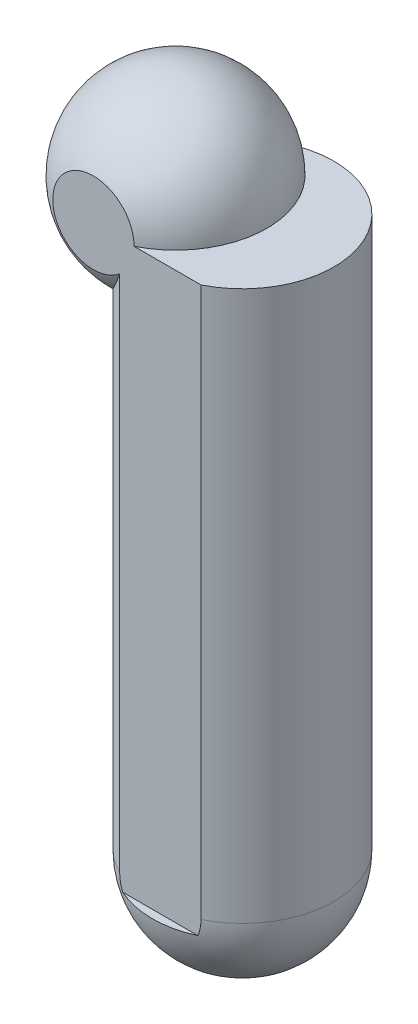
ISO-10303-21;
HEADER;
FILE_DESCRIPTION(('STEP AP214'),'2;1');
FILE_NAME('part.step','',(''),(''),'','','');
FILE_SCHEMA(('AUTOMOTIVE_DESIGN { 1 0 10303 214 1 1 1 1 }'));
ENDSEC;
DATA;
#1=APPLICATION_CONTEXT('core data for automotive mechanical design processes');
#2=APPLICATION_PROTOCOL_DEFINITION('international standard','automotive_design',2000,#1);
#3=PRODUCT_CONTEXT('',#1,'mechanical');
#4=PRODUCT('Part','Part','',(#3));
#5=PRODUCT_RELATED_PRODUCT_CATEGORY('part','',(#4));
#6=PRODUCT_DEFINITION_FORMATION('','',#4);
#7=PRODUCT_DEFINITION_CONTEXT('part definition',#1,'design');
#8=PRODUCT_DEFINITION('design','',#6,#7);
#9=PRODUCT_DEFINITION_SHAPE('','',#8);
#10=(LENGTH_UNIT() NAMED_UNIT(*) SI_UNIT(.MILLI.,.METRE.));
#11=(NAMED_UNIT(*) PLANE_ANGLE_UNIT() SI_UNIT($,.RADIAN.));
#12=(NAMED_UNIT(*) SI_UNIT($,.STERADIAN.) SOLID_ANGLE_UNIT());
#13=UNCERTAINTY_MEASURE_WITH_UNIT(LENGTH_MEASURE(1.E-05),#10,'distance_accuracy_value','');
#14=(GEOMETRIC_REPRESENTATION_CONTEXT(3) GLOBAL_UNCERTAINTY_ASSIGNED_CONTEXT((#13)) GLOBAL_UNIT_ASSIGNED_CONTEXT((#10,
#11,#12)) REPRESENTATION_CONTEXT('',''));
#15=CARTESIAN_POINT('',(0.,0.,0.));
#16=DIRECTION('',(0.,0.,1.));
#17=DIRECTION('',(1.,0.,0.));
#18=AXIS2_PLACEMENT_3D('',#15,#16,#17);
#19=CARTESIAN_POINT('',(0.,300.,0.));
#20=DIRECTION('',(0.,-1.,0.));
#21=DIRECTION('',(0.,0.,-1.));
#22=AXIS2_PLACEMENT_3D('',#19,#20,#21);
#23=CYLINDRICAL_SURFACE('',#22,50.);
#24=CARTESIAN_POINT('',(0.,300.,0.));
#25=DIRECTION('',(0.,1.,0.));
#26=DIRECTION('',(0.,0.,1.));
#27=AXIS2_PLACEMENT_3D('',#24,#25,#26);
#28=CIRCLE('',#27,50.);
#29=CARTESIAN_POINT('',(22.1848657358327,300.,44.8088354265437));
#30=VERTEX_POINT('',#29);
#31=CARTESIAN_POINT('',(-18.26341711681,300.,-46.5451135482277));
#32=VERTEX_POINT('',#31);
#33=EDGE_CURVE('E115',#30,#32,#28,.T.);
#34=ORIENTED_EDGE('',*,*,#33,.F.);
#35=DIRECTION('',(0.,-1.,0.));
#36=VECTOR('',#35,1.);
#37=CARTESIAN_POINT('',(22.1848657358327,300.,44.8088354265437));
#38=LINE('',#37,#36);
#39=CARTESIAN_POINT('',(22.1848657358327,0.,44.8088354265437));
#40=VERTEX_POINT('',#39);
#41=EDGE_CURVE('E136',#30,#40,#38,.T.);
#42=ORIENTED_EDGE('',*,*,#41,.T.);
#43=CARTESIAN_POINT('',(0.,0.,0.));
#44=DIRECTION('',(0.,1.,0.));
#45=DIRECTION('',(0.,0.,1.));
#46=AXIS2_PLACEMENT_3D('',#43,#44,#45);
#47=CIRCLE('',#46,50.);
#48=CARTESIAN_POINT('',(-47.1795612546556,0.,-16.5556334768018));
#49=VERTEX_POINT('',#48);
#50=EDGE_CURVE('E54',#40,#49,#47,.T.);
#51=ORIENTED_EDGE('',*,*,#50,.T.);
#52=DIRECTION('',(0.,-1.,0.));
#53=VECTOR('',#52,1.);
#54=CARTESIAN_POINT('',(-47.1795612546556,300.,-16.5556334768018));
#55=LINE('',#54,#53);
#56=CARTESIAN_POINT('',(-47.1795612546556,247.914072229141,-16.5556334768018));
#57=VERTEX_POINT('',#56);
#58=EDGE_CURVE('E104',#49,#57,#55,.F.);
#59=ORIENTED_EDGE('',*,*,#58,.T.);
#60=CARTESIAN_POINT('',(0.,247.914072229141,0.));
#61=DIRECTION('',(0.,1.,0.));
#62=DIRECTION('',(0.,0.,1.));
#63=AXIS2_PLACEMENT_3D('',#60,#61,#62);
#64=CIRCLE('',#63,50.);
#65=CARTESIAN_POINT('',(-47.1795612546556,247.914072229141,16.5556334768018));
#66=VERTEX_POINT('',#65);
#67=EDGE_CURVE('E89',#57,#66,#64,.T.);
#68=ORIENTED_EDGE('',*,*,#67,.T.);
#69=DIRECTION('',(0.,-1.,0.));
#70=VECTOR('',#69,1.);
#71=CARTESIAN_POINT('',(-47.1795612546556,300.,16.5556334768018));
#72=LINE('',#71,#70);
#73=CARTESIAN_POINT('',(-47.1795612546556,0.,16.5556334768018));
#74=VERTEX_POINT('',#73);
#75=EDGE_CURVE('E99',#66,#74,#72,.T.);
#76=ORIENTED_EDGE('',*,*,#75,.T.);
#77=CARTESIAN_POINT('',(-22.1848657358327,0.,44.8088354265437));
#78=VERTEX_POINT('',#77);
#79=EDGE_CURVE('E98',#74,#78,#47,.T.);
#80=ORIENTED_EDGE('',*,*,#79,.T.);
#81=DIRECTION('',(0.,-1.,0.));
#82=VECTOR('',#81,1.);
#83=CARTESIAN_POINT('',(-22.1848657358327,300.,44.8088354265437));
#84=LINE('',#83,#82);
#85=CARTESIAN_POINT('',(-22.1848657358327,283.074391965858,44.8088354265437));
#86=VERTEX_POINT('',#85);
#87=EDGE_CURVE('E92',#78,#86,#84,.F.);
#88=ORIENTED_EDGE('',*,*,#87,.T.);
#89=CARTESIAN_POINT('',(-18.2634171173575,300.0002,46.5451135480129));
#90=CARTESIAN_POINT('',(-18.2633706675614,299.438291616511,46.5451056879245));
#91=CARTESIAN_POINT('',(-18.2763760333173,298.876398321375,46.5400280630606));
#92=CARTESIAN_POINT('',(-18.328168188604,297.754032021396,46.5196696715049));
#93=CARTESIAN_POINT('',(-18.3669528141591,297.193558901304,46.5043897612181));
#94=CARTESIAN_POINT('',(-18.4699216009916,296.075977124054,46.4635868956935));
#95=CARTESIAN_POINT('',(-18.5340762347552,295.518865317332,46.4380758477325));
#96=CARTESIAN_POINT('',(-18.6871415639893,294.408670558581,46.3766910033255));
#97=CARTESIAN_POINT('',(-18.7760525678627,293.855587656831,46.3408170777836));
#98=CARTESIAN_POINT('',(-19.0768005055243,292.214923929526,46.2182111522955));
#99=CARTESIAN_POINT('',(-19.323716625795,291.134695583978,46.1160908362883));
#100=CARTESIAN_POINT('',(-19.9033617641019,289.002638849014,45.8688879412764));
#101=CARTESIAN_POINT('',(-20.236111214989,287.95081728786,45.7237951313356));
#102=CARTESIAN_POINT('',(-20.9756494862914,285.886190725913,45.389270808122));
#103=CARTESIAN_POINT('',(-21.3821102117373,284.873236012066,45.2000347520667));
#104=CARTESIAN_POINT('',(-22.2591756165244,282.885895879521,44.7746181864288));
#105=CARTESIAN_POINT('',(-22.7297781283846,281.911509158967,44.5384392630174));
#106=CARTESIAN_POINT('',(-23.7253457748678,280.001800649563,44.0161849198013));
#107=CARTESIAN_POINT('',(-24.250436923628,279.066576765186,43.7299927421331));
#108=CARTESIAN_POINT('',(-25.3432905791781,277.239384996309,43.1058419828712));
#109=CARTESIAN_POINT('',(-25.9110555557987,276.347419620402,42.767880403846));
#110=CARTESIAN_POINT('',(-27.1419254846316,274.513999714539,41.9987796679562));
#111=CARTESIAN_POINT('',(-27.8087096976246,273.577578186356,41.561523003715));
#112=CARTESIAN_POINT('',(-29.1686956526184,271.760017139765,40.618616200136));
#113=CARTESIAN_POINT('',(-29.8618985483403,270.878880040121,40.1129630714155));
#114=CARTESIAN_POINT('',(-31.2622210576051,269.172443064,39.0314745246132));
#115=CARTESIAN_POINT('',(-31.9693409348175,268.347144246747,38.4556377757647));
#116=CARTESIAN_POINT('',(-33.3855959086729,266.752953586689,37.2327512296918));
#117=CARTESIAN_POINT('',(-34.0947311308691,265.984065341908,36.5856968965796));
#118=CARTESIAN_POINT('',(-35.603106806281,264.398854129748,35.1236482272168));
#119=CARTESIAN_POINT('',(-36.4009686478656,263.591106204989,34.2978364817075));
#120=CARTESIAN_POINT('',(-37.5764193766428,262.436270456265,32.9902581991849));
#121=CARTESIAN_POINT('',(-37.9647550383641,262.060719927954,32.5428253270963));
#122=CARTESIAN_POINT('',(-38.7324286057101,261.328688271124,31.625251012536));
#123=CARTESIAN_POINT('',(-39.111767539225,260.972204958246,31.1551121830731));
#124=CARTESIAN_POINT('',(-39.8596222732365,260.278439596798,30.1924190722799));
#125=CARTESIAN_POINT('',(-40.228136146836,259.941160956818,29.6998608395279));
#126=CARTESIAN_POINT('',(-40.9523935261898,259.286117627236,28.6929606543736));
#127=CARTESIAN_POINT('',(-41.3081384959973,258.968350697478,28.1786212141905));
#128=CARTESIAN_POINT('',(-42.0051212156945,258.352510268157,27.1287088263707));
#129=CARTESIAN_POINT('',(-42.3463582854785,258.054437691469,26.5931348855662));
#130=CARTESIAN_POINT('',(-43.0125298786124,257.478282508452,25.5015885650983));
#131=CARTESIAN_POINT('',(-43.3374665112477,257.200197313717,24.9456188408636));
#132=CARTESIAN_POINT('',(-43.9525568744535,256.678524328517,23.8442675026636));
#133=CARTESIAN_POINT('',(-44.2436414279125,256.433887713725,23.299902218234));
#134=CARTESIAN_POINT('',(-44.8083505861131,255.96296779157,22.194522916534));
#135=CARTESIAN_POINT('',(-45.0819773944395,255.73668216689,21.633511013614));
#136=CARTESIAN_POINT('',(-45.6105480789855,255.302624825749,20.4956454372086));
#137=CARTESIAN_POINT('',(-45.8654896758902,255.094855367315,19.9187898427911));
#138=CARTESIAN_POINT('',(-46.3554032499383,254.698101678194,18.7504085969103));
#139=CARTESIAN_POINT('',(-46.5903775787053,254.509115234911,18.1588846836225));
#140=CARTESIAN_POINT('',(-47.0391522757507,254.150188528722,16.9624925575893));
#141=CARTESIAN_POINT('',(-47.2529617786514,253.98024004493,16.3576302406706));
#142=CARTESIAN_POINT('',(-47.6584470716424,253.659515719264,15.1356145914089));
#143=CARTESIAN_POINT('',(-47.850125533872,253.50873756251,14.5184627534959));
#144=CARTESIAN_POINT('',(-48.2104228310769,253.226518670691,13.2731015751038));
#145=CARTESIAN_POINT('',(-48.3790421616044,253.09507752006,12.6448924725784));
#146=CARTESIAN_POINT('',(-48.6923684845438,252.851709746588,11.3788714946846));
#147=CARTESIAN_POINT('',(-48.8370761199908,252.73978259897,10.7410598780511));
#148=CARTESIAN_POINT('',(-49.2066136847244,252.45478070102,8.94911026448803));
#149=CARTESIAN_POINT('',(-49.4042568644723,252.303386543607,7.78569976100374));
#150=CARTESIAN_POINT('',(-49.7170771317958,252.064423963926,5.44158819687962));
#151=CARTESIAN_POINT('',(-49.8322605742767,251.976850623186,4.26088847582192));
#152=CARTESIAN_POINT('',(-49.9782935268578,251.865904298067,1.89161429183928));
#153=CARTESIAN_POINT('',(-50.0091696801626,251.842511031174,0.703042435763068));
#154=CARTESIAN_POINT('',(-49.9861281723121,251.859990564983,-1.67278848298961));
#155=CARTESIAN_POINT('',(-49.9322122375257,251.900862057252,-2.86004757190154));
#156=CARTESIAN_POINT('',(-49.7456213231713,252.042777602342,-5.16076666631049));
#157=CARTESIAN_POINT('',(-49.6172951693616,252.140500026633,-6.27478866365199));
#158=CARTESIAN_POINT('',(-49.2874005146426,252.392944467121,-8.48533232714789));
#159=CARTESIAN_POINT('',(-49.0858354907753,252.547663777376,-9.58185482151811));
#160=CARTESIAN_POINT('',(-48.6124444259191,252.913471065543,-11.7499547903294));
#161=CARTESIAN_POINT('',(-48.3406218337168,253.124556276597,-12.8215334863918));
#162=CARTESIAN_POINT('',(-47.7306496107886,253.602301017697,-14.9329400816633));
#163=CARTESIAN_POINT('',(-47.3924983152991,253.868961942631,-15.9727671831917));
#164=CARTESIAN_POINT('',(-46.6489453518329,254.461487825162,-18.030279109239));
#165=CARTESIAN_POINT('',(-46.2425806526093,254.788208077099,-19.0473690968197));
#166=CARTESIAN_POINT('',(-45.3722441690019,255.496912432746,-21.0365911978686));
#167=CARTESIAN_POINT('',(-44.9082722939534,255.878896623433,-22.0087232405766));
#168=CARTESIAN_POINT('',(-43.9291719130096,256.697056818305,-23.9032415049215));
#169=CARTESIAN_POINT('',(-43.4140376938643,257.133238876083,-24.8256221530812));
#170=CARTESIAN_POINT('',(-42.3397198305363,258.058656160336,-26.6165110691971));
#171=CARTESIAN_POINT('',(-41.7805344368053,258.54789349426,-27.4850171950073));
#172=CARTESIAN_POINT('',(-40.5834008658501,259.616061911265,-29.226425123243));
#173=CARTESIAN_POINT('',(-39.9426832315221,260.198935518207,-30.0950059125553));
#174=CARTESIAN_POINT('',(-38.628990020304,261.423392528277,-31.7636407136471));
#175=CARTESIAN_POINT('',(-37.9560130328787,262.06497849971,-32.5636917247023));
#176=CARTESIAN_POINT('',(-36.5876892669917,263.40621262827,-34.0939143506087));
#177=CARTESIAN_POINT('',(-35.8923303998847,264.105892495915,-34.8240473262983));
#178=CARTESIAN_POINT('',(-34.490296093346,265.562182698343,-36.2131674834495));
#179=CARTESIAN_POINT('',(-33.7836202551915,266.318795042478,-36.8721521518321));
#180=CARTESIAN_POINT('',(-32.2973141920349,267.969125250567,-38.1832903165675));
#181=CARTESIAN_POINT('',(-31.5176609573159,268.868939585253,-38.8277604886521));
#182=CARTESIAN_POINT('',(-29.9737894186432,270.736411791761,-40.0316177153266));
#183=CARTESIAN_POINT('',(-29.2095731607661,271.704078581989,-40.5909935545275));
#184=CARTESIAN_POINT('',(-27.7131890591531,273.706593501042,-41.6270041181267));
#185=CARTESIAN_POINT('',(-26.9810274837852,274.741454672505,-42.1036227127237));
#186=CARTESIAN_POINT('',(-25.5668026974897,276.876885029176,-42.9770774682403));
#187=CARTESIAN_POINT('',(-24.8847286977495,277.977439970876,-43.3739308426872));
#188=CARTESIAN_POINT('',(-23.7021770401367,280.045141325865,-44.0293240617946));
#189=CARTESIAN_POINT('',(-23.1907431867966,281.002220324324,-44.2999152843486));
#190=CARTESIAN_POINT('',(-22.2260502098298,282.957687295449,-44.7916941835005));
#191=CARTESIAN_POINT('',(-21.7727901408716,283.956074596501,-45.0128826629424));
#192=CARTESIAN_POINT('',(-20.9369457051354,285.987856175378,-45.4076817257322));
#193=CARTESIAN_POINT('',(-20.5541676004421,287.021144964002,-45.5814233846928));
#194=CARTESIAN_POINT('',(-19.8686672938254,289.12022385172,-45.8843867255464));
#195=CARTESIAN_POINT('',(-19.5659193324688,290.18600336948,-46.0136227366099));
#196=CARTESIAN_POINT('',(-19.1379003840921,291.975619268592,-46.1927964639019));
#197=CARTESIAN_POINT('',(-18.9873012468857,292.692292664948,-46.2547509608254));
#198=CARTESIAN_POINT('',(-18.7272863503472,294.134268864328,-46.3606358950334));
#199=CARTESIAN_POINT('',(-18.6178608441782,294.859569583055,-46.4045705982797));
#200=CARTESIAN_POINT('',(-18.4415716398644,296.319063236357,-46.4749129518123));
#201=CARTESIAN_POINT('',(-18.37487289462,297.053279614542,-46.5012526907036));
#202=CARTESIAN_POINT('',(-18.3080570100061,298.156983829496,-46.5275782709238));
#203=CARTESIAN_POINT('',(-18.2913237267632,298.525383753275,-46.5341561203978));
#204=CARTESIAN_POINT('',(-18.2690002884638,299.262580349516,-46.5429232703317));
#205=CARTESIAN_POINT('',(-18.2634103536338,299.631377029676,-46.5451124840589));
#206=CARTESIAN_POINT('',(-18.2634171173575,300.0002,-46.5451135480129));
#207=B_SPLINE_CURVE_WITH_KNOTS('',3,(#89,#90,#91,#92,#93,#94,#95,#96,#97,#98,#99,#100,#101,#102,
#103,#104,#105,#106,#107,#108,#109,#110,#111,#112,#113,#114,#115,#116,#117,#118,#119,#120,#121,
#122,#123,#124,#125,#126,#127,#128,#129,#130,#131,#132,#133,#134,#135,#136,#137,#138,#139,#140,
#141,#142,#143,#144,#145,#146,#147,#148,#149,#150,#151,#152,#153,#154,#155,#156,#157,#158,#159,
#160,#161,#162,#163,#164,#165,#166,#167,#168,#169,#170,#171,#172,#173,#174,#175,#176,#177,#178,
#179,#180,#181,#182,#183,#184,#185,#186,#187,#188,#189,#190,#191,#192,#193,#194,#195,#196,#197,
#198,#199,#200,#201,#202,#203,#204,#205,#206),.UNSPECIFIED.,.F.,.F.,(4,2,2,2,2,2,2,2,2,2,2,2,2,
2,2,2,2,2,2,2,2,2,2,2,2,2,2,2,2,2,2,2,2,2,2,2,2,2,2,2,2,2,2,2,2,2,2,2,2,2,2,2,2,2,2,2,2,2,4),
(0.,1.68552545510654,3.37090944084257,5.05433759671092,6.73778672483935,10.0709535849576,
13.4049146476825,16.7243847991785,20.0437428068407,23.3709561080844,26.6983621267658,
30.3845218168354,34.0708426688043,37.7572334287596,41.4438591130149,45.6497996940682,
47.7536142035747,49.8571871796586,51.961132357279,54.0648355257291,56.1686372037203,
58.2721659426625,60.2635235935785,62.2546293882194,64.2459776649673,66.2370910868182,
68.2273413735989,70.217351102333,72.2073180580424,74.197231490699,77.7614695060561,
81.3254328075383,84.8882696773668,88.4510340086889,91.8239957779015,95.1967974354416,
98.5694335611412,101.942154346425,105.367264694717,108.792380433671,112.217879082981,
115.64351384897,119.319601052535,122.995849139315,126.674117265078,130.352515271046,
134.409492645547,138.467004265158,142.525305828552,146.582730658119,149.934812711069,
153.286840285357,156.629511721955,159.971105933749,162.174644665487,164.377661435366,
166.589132815959,167.695478801263,168.801846651123),.UNSPECIFIED.);
#208=EDGE_CURVE('E102',#86,#32,#207,.T.);
#209=ORIENTED_EDGE('',*,*,#208,.T.);
#210=EDGE_LOOP('',(#34,#42,#51,#59,#68,#76,#80,#88,#209));
#211=FACE_BOUND('',#210,.T.);
#212=ADVANCED_FACE('F32',(#211),#23,.T.);
#213=CARTESIAN_POINT('',(0.,300.,0.));
#214=DIRECTION('',(0.,1.,0.));
#215=DIRECTION('',(0.,0.,1.));
#216=AXIS2_PLACEMENT_3D('',#213,#214,#215);
#217=PLANE('',#216);
#218=DIRECTION('',(-1.,0.,0.));
#219=VECTOR('',#218,1.);
#220=CARTESIAN_POINT('',(0.,300.,44.8088354265437));
#221=LINE('',#220,#219);
#222=CARTESIAN_POINT('',(-14.3419684977872,300.,44.8088354265437));
#223=VERTEX_POINT('',#222);
#224=EDGE_CURVE('E131',#30,#223,#221,.T.);
#225=ORIENTED_EDGE('',*,*,#224,.F.);
#226=ORIENTED_EDGE('',*,*,#33,.T.);
#227=CARTESIAN_POINT('',(-36.5268342336199,300.,0.));
#228=DIRECTION('',(0.,1.,0.));
#229=DIRECTION('',(0.,0.,1.));
#230=AXIS2_PLACEMENT_3D('',#227,#228,#229);
#231=CIRCLE('',#230,50.);
#232=EDGE_CURVE('E134',#223,#32,#231,.T.);
#233=ORIENTED_EDGE('',*,*,#232,.F.);
#234=EDGE_LOOP('',(#225,#226,#233));
#235=FACE_BOUND('',#234,.T.);
#236=ADVANCED_FACE('F121',(#235),#217,.T.);
#237=CARTESIAN_POINT('',(-36.5268342336199,300.,0.));
#238=DIRECTION('',(0.,-1.,0.));
#239=DIRECTION('',(-1.,0.,0.));
#240=AXIS2_PLACEMENT_3D('',#237,#238,#239);
#241=SPHERICAL_SURFACE('',#240,50.);
#242=CARTESIAN_POINT('',(-36.5268342336199,300.,44.8088354265437));
#243=DIRECTION('',(0.,0.,-1.));
#244=DIRECTION('',(-1.,0.,0.));
#245=AXIS2_PLACEMENT_3D('',#242,#243,#244);
#246=CIRCLE('',#245,22.1848657358327);
#247=EDGE_CURVE('E137',#223,#86,#246,.F.);
#248=ORIENTED_EDGE('',*,*,#247,.F.);
#249=ORIENTED_EDGE('',*,*,#232,.T.);
#250=ORIENTED_EDGE('',*,*,#208,.F.);
#251=EDGE_LOOP('',(#248,#249,#250));
#252=FACE_BOUND('',#251,.T.);
#253=ADVANCED_FACE('F117',(#252),#241,.T.);
#254=CARTESIAN_POINT('',(0.,0.,0.));
#255=DIRECTION('',(0.,-1.,0.));
#256=DIRECTION('',(-1.,0.,0.));
#257=AXIS2_PLACEMENT_3D('',#254,#255,#256);
#258=SPHERICAL_SURFACE('',#257,50.);
#259=CARTESIAN_POINT('',(0.,0.,44.8088354265437));
#260=DIRECTION('',(0.,0.,-1.));
#261=DIRECTION('',(-1.,0.,0.));
#262=AXIS2_PLACEMENT_3D('',#259,#260,#261);
#263=CIRCLE('',#262,22.1848657358327);
#264=CARTESIAN_POINT('',(20.5189256715935,-8.43456916508156,44.8088354265437));
#265=VERTEX_POINT('',#264);
#266=EDGE_CURVE('E11',#265,#40,#263,.F.);
#267=ORIENTED_EDGE('',*,*,#266,.F.);
#268=CARTESIAN_POINT('',(0.,-8.43456916508156,0.));
#269=DIRECTION('',(0.,-1.,0.));
#270=DIRECTION('',(0.,0.,-1.));
#271=AXIS2_PLACEMENT_3D('',#268,#269,#270);
#272=CIRCLE('',#271,49.2834459326806);
#273=CARTESIAN_POINT('',(-20.5189256715935,-8.43456916508156,44.8088354265437));
#274=VERTEX_POINT('',#273);
#275=EDGE_CURVE('E84',#274,#265,#272,.F.);
#276=ORIENTED_EDGE('',*,*,#275,.F.);
#277=EDGE_CURVE('E36',#78,#274,#263,.F.);
#278=ORIENTED_EDGE('',*,*,#277,.F.);
#279=ORIENTED_EDGE('',*,*,#79,.F.);
#280=CARTESIAN_POINT('',(-47.1795612546556,0.,0.));
#281=DIRECTION('',(1.,0.,0.));
#282=DIRECTION('',(0.,0.,-1.));
#283=AXIS2_PLACEMENT_3D('',#280,#281,#282);
#284=CIRCLE('',#283,16.5556334768018);
#285=EDGE_CURVE('E97',#49,#74,#284,.F.);
#286=ORIENTED_EDGE('',*,*,#285,.F.);
#287=ORIENTED_EDGE('',*,*,#50,.F.);
#288=EDGE_LOOP('',(#267,#276,#278,#279,#286,#287));
#289=FACE_BOUND('',#288,.T.);
#290=ADVANCED_FACE('F94',(#289),#258,.T.);
#291=CARTESIAN_POINT('',(-59.7766933543111,247.914072229141,-50.));
#292=DIRECTION('',(0.,1.,0.));
#293=DIRECTION('',(0.,0.,1.));
#294=AXIS2_PLACEMENT_3D('',#291,#292,#293);
#295=PLANE('',#294);
#296=DIRECTION('',(0.,0.,1.));
#297=VECTOR('',#296,1.);
#298=CARTESIAN_POINT('',(-47.1795612546556,247.914072229141,-50.));
#299=LINE('',#298,#297);
#300=EDGE_CURVE('E148',#57,#66,#299,.T.);
#301=ORIENTED_EDGE('',*,*,#300,.T.);
#302=ORIENTED_EDGE('',*,*,#67,.F.);
#303=EDGE_LOOP('',(#301,#302));
#304=FACE_BOUND('',#303,.T.);
#305=ADVANCED_FACE('F147',(#304),#295,.F.);
#306=CARTESIAN_POINT('',(-47.1795612546556,247.914072229141,-50.));
#307=DIRECTION('',(1.,0.,0.));
#308=DIRECTION('',(0.,0.,-1.));
#309=AXIS2_PLACEMENT_3D('',#306,#307,#308);
#310=PLANE('',#309);
#311=ORIENTED_EDGE('',*,*,#300,.F.);
#312=ORIENTED_EDGE('',*,*,#58,.F.);
#313=ORIENTED_EDGE('',*,*,#285,.T.);
#314=ORIENTED_EDGE('',*,*,#75,.F.);
#315=EDGE_LOOP('',(#311,#312,#313,#314));
#316=FACE_BOUND('',#315,.T.);
#317=ADVANCED_FACE('F150',(#316),#310,.F.);
#318=CARTESIAN_POINT('',(-86.5268342336199,-8.43456916508156,44.8088354265437));
#319=DIRECTION('',(0.,0.,-1.));
#320=DIRECTION('',(-1.,0.,0.));
#321=AXIS2_PLACEMENT_3D('',#318,#319,#320);
#322=PLANE('',#321);
#323=ORIENTED_EDGE('',*,*,#266,.T.);
#324=ORIENTED_EDGE('',*,*,#41,.F.);
#325=ORIENTED_EDGE('',*,*,#224,.T.);
#326=ORIENTED_EDGE('',*,*,#247,.T.);
#327=ORIENTED_EDGE('',*,*,#87,.F.);
#328=ORIENTED_EDGE('',*,*,#277,.T.);
#329=DIRECTION('',(1.,0.,0.));
#330=VECTOR('',#329,1.);
#331=CARTESIAN_POINT('',(-86.5268342336199,-8.43456916508156,44.8088354265437));
#332=LINE('',#331,#330);
#333=EDGE_CURVE('E46',#274,#265,#332,.T.);
#334=ORIENTED_EDGE('',*,*,#333,.T.);
#335=EDGE_LOOP('',(#323,#324,#325,#326,#327,#328,#334));
#336=FACE_BOUND('',#335,.T.);
#337=ADVANCED_FACE('F91',(#336),#322,.F.);
#338=CARTESIAN_POINT('',(-86.5268342336199,-8.43456916508156,58.7586164803255));
#339=DIRECTION('',(0.,-1.,0.));
#340=DIRECTION('',(0.,0.,-1.));
#341=AXIS2_PLACEMENT_3D('',#338,#339,#340);
#342=PLANE('',#341);
#343=ORIENTED_EDGE('',*,*,#275,.T.);
#344=ORIENTED_EDGE('',*,*,#333,.F.);
#345=EDGE_LOOP('',(#343,#344));
#346=FACE_BOUND('',#345,.T.);
#347=ADVANCED_FACE('F85',(#346),#342,.F.);
#348=CLOSED_SHELL('',(#212,#236,#253,#290,#305,#317,#337,#347));
#349=MANIFOLD_SOLID_BREP('B2',#348);
#350=ADVANCED_BREP_SHAPE_REPRESENTATION('',(#18,#349),#14);
#351=SHAPE_DEFINITION_REPRESENTATION(#9,#350);
ENDSEC;
END-ISO-10303-21;
